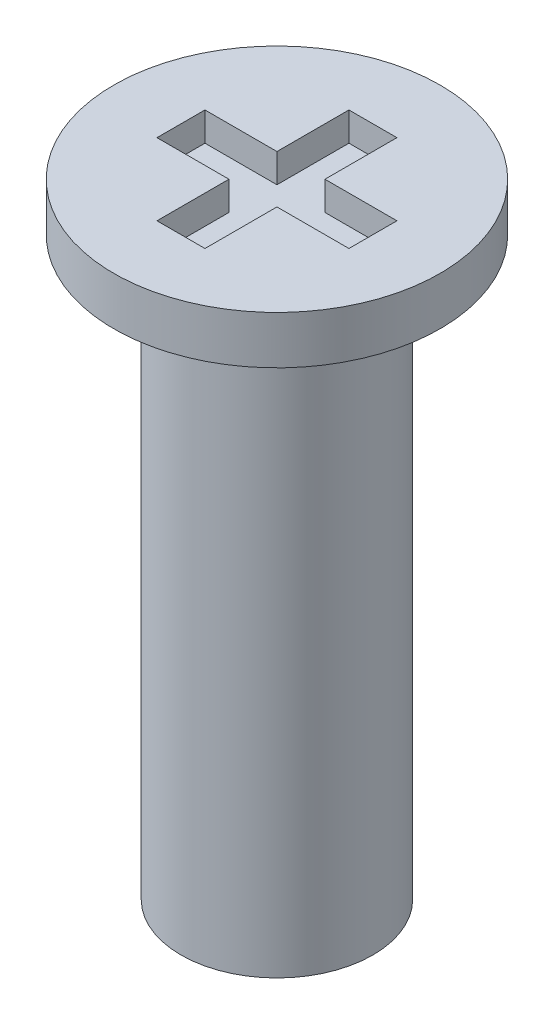
ISO-10303-21;
HEADER;
FILE_DESCRIPTION(('STEP AP214'),'2;1');
FILE_NAME('part.step','',(''),(''),'','','');
FILE_SCHEMA(('AUTOMOTIVE_DESIGN { 1 0 10303 214 1 1 1 1 }'));
ENDSEC;
DATA;
#1=APPLICATION_CONTEXT('core data for automotive mechanical design processes');
#2=APPLICATION_PROTOCOL_DEFINITION('international standard','automotive_design',2000,#1);
#3=PRODUCT_CONTEXT('',#1,'mechanical');
#4=PRODUCT('Part','Part','',(#3));
#5=PRODUCT_RELATED_PRODUCT_CATEGORY('part','',(#4));
#6=PRODUCT_DEFINITION_FORMATION('','',#4);
#7=PRODUCT_DEFINITION_CONTEXT('part definition',#1,'design');
#8=PRODUCT_DEFINITION('design','',#6,#7);
#9=PRODUCT_DEFINITION_SHAPE('','',#8);
#10=(LENGTH_UNIT() NAMED_UNIT(*) SI_UNIT(.MILLI.,.METRE.));
#11=(NAMED_UNIT(*) PLANE_ANGLE_UNIT() SI_UNIT($,.RADIAN.));
#12=(NAMED_UNIT(*) SI_UNIT($,.STERADIAN.) SOLID_ANGLE_UNIT());
#13=UNCERTAINTY_MEASURE_WITH_UNIT(LENGTH_MEASURE(1.E-05),#10,'distance_accuracy_value','');
#14=(GEOMETRIC_REPRESENTATION_CONTEXT(3) GLOBAL_UNCERTAINTY_ASSIGNED_CONTEXT((#13)) GLOBAL_UNIT_ASSIGNED_CONTEXT((#10,
#11,#12)) REPRESENTATION_CONTEXT('',''));
#15=CARTESIAN_POINT('',(0.,0.,0.));
#16=DIRECTION('',(0.,0.,1.));
#17=DIRECTION('',(1.,0.,0.));
#18=AXIS2_PLACEMENT_3D('',#15,#16,#17);
#19=CARTESIAN_POINT('',(0.,0.,0.));
#20=DIRECTION('',(0.,1.,0.));
#21=DIRECTION('',(0.,0.,1.));
#22=AXIS2_PLACEMENT_3D('',#19,#20,#21);
#23=PLANE('',#22);
#24=DIRECTION('',(-1.,0.,0.));
#25=VECTOR('',#24,1.);
#26=CARTESIAN_POINT('',(0.,0.,-0.25));
#27=LINE('',#26,#25);
#28=CARTESIAN_POINT('',(1.,0.,-0.249999999999997));
#29=VERTEX_POINT('',#28);
#30=CARTESIAN_POINT('',(0.25,0.,-0.249999999999999));
#31=VERTEX_POINT('',#30);
#32=EDGE_CURVE('E194',#29,#31,#27,.T.);
#33=ORIENTED_EDGE('',*,*,#32,.F.);
#34=DIRECTION('',(0.,0.,-1.));
#35=VECTOR('',#34,1.);
#36=CARTESIAN_POINT('',(1.,0.,-0.249999999999997));
#37=LINE('',#36,#35);
#38=CARTESIAN_POINT('',(0.999999999999999,0.,0.250000000000003));
#39=VERTEX_POINT('',#38);
#40=EDGE_CURVE('E140',#39,#29,#37,.T.);
#41=ORIENTED_EDGE('',*,*,#40,.F.);
#42=DIRECTION('',(1.,0.,0.));
#43=VECTOR('',#42,1.);
#44=CARTESIAN_POINT('',(0.,0.,0.25));
#45=LINE('',#44,#43);
#46=CARTESIAN_POINT('',(0.25,0.,0.250000000000003));
#47=VERTEX_POINT('',#46);
#48=EDGE_CURVE('E196',#47,#39,#45,.T.);
#49=ORIENTED_EDGE('',*,*,#48,.F.);
#50=DIRECTION('',(0.,0.,-1.));
#51=VECTOR('',#50,1.);
#52=CARTESIAN_POINT('',(0.25,0.,0.));
#53=LINE('',#52,#51);
#54=CARTESIAN_POINT('',(0.25,0.,1.));
#55=VERTEX_POINT('',#54);
#56=EDGE_CURVE('E166',#55,#47,#53,.T.);
#57=ORIENTED_EDGE('',*,*,#56,.F.);
#58=DIRECTION('',(1.,0.,0.));
#59=VECTOR('',#58,1.);
#60=CARTESIAN_POINT('',(0.25,0.,1.));
#61=LINE('',#60,#59);
#62=CARTESIAN_POINT('',(-0.25,0.,1.));
#63=VERTEX_POINT('',#62);
#64=EDGE_CURVE('E170',#63,#55,#61,.T.);
#65=ORIENTED_EDGE('',*,*,#64,.F.);
#66=DIRECTION('',(0.,0.,1.));
#67=VECTOR('',#66,1.);
#68=CARTESIAN_POINT('',(-0.25,0.,0.));
#69=LINE('',#68,#67);
#70=CARTESIAN_POINT('',(-0.25,0.,0.249999999999998));
#71=VERTEX_POINT('',#70);
#72=EDGE_CURVE('E178',#71,#63,#69,.T.);
#73=ORIENTED_EDGE('',*,*,#72,.F.);
#74=DIRECTION('',(1.,0.,0.));
#75=VECTOR('',#74,1.);
#76=CARTESIAN_POINT('',(0.,0.,0.25));
#77=LINE('',#76,#75);
#78=CARTESIAN_POINT('',(-1.,0.,0.24999999999999));
#79=VERTEX_POINT('',#78);
#80=EDGE_CURVE('E159',#79,#71,#77,.T.);
#81=ORIENTED_EDGE('',*,*,#80,.F.);
#82=DIRECTION('',(0.,0.,1.));
#83=VECTOR('',#82,1.);
#84=CARTESIAN_POINT('',(-1.,0.,0.24999999999999));
#85=LINE('',#84,#83);
#86=CARTESIAN_POINT('',(-0.999999999999997,0.,-0.25000000000001));
#87=VERTEX_POINT('',#86);
#88=EDGE_CURVE('E156',#87,#79,#85,.T.);
#89=ORIENTED_EDGE('',*,*,#88,.F.);
#90=CARTESIAN_POINT('',(-0.25,0.,-0.250000000000001));
#91=VERTEX_POINT('',#90);
#92=EDGE_CURVE('E146',#91,#87,#27,.T.);
#93=ORIENTED_EDGE('',*,*,#92,.F.);
#94=DIRECTION('',(0.,0.,1.));
#95=VECTOR('',#94,1.);
#96=CARTESIAN_POINT('',(-0.25,0.,0.));
#97=LINE('',#96,#95);
#98=CARTESIAN_POINT('',(-0.25,0.,-1.));
#99=VERTEX_POINT('',#98);
#100=EDGE_CURVE('E208',#99,#91,#97,.T.);
#101=ORIENTED_EDGE('',*,*,#100,.F.);
#102=DIRECTION('',(-1.,0.,0.));
#103=VECTOR('',#102,1.);
#104=CARTESIAN_POINT('',(-0.25,0.,-1.));
#105=LINE('',#104,#103);
#106=CARTESIAN_POINT('',(0.25,0.,-1.));
#107=VERTEX_POINT('',#106);
#108=EDGE_CURVE('E211',#107,#99,#105,.T.);
#109=ORIENTED_EDGE('',*,*,#108,.F.);
#110=DIRECTION('',(0.,0.,-1.));
#111=VECTOR('',#110,1.);
#112=CARTESIAN_POINT('',(0.25,0.,0.));
#113=LINE('',#112,#111);
#114=EDGE_CURVE('E66',#31,#107,#113,.T.);
#115=ORIENTED_EDGE('',*,*,#114,.F.);
#116=EDGE_LOOP('',(#33,#41,#49,#57,#65,#73,#81,#89,#93,#101,#109,#115));
#117=FACE_BOUND('',#116,.T.);
#118=CARTESIAN_POINT('',(0.,0.,0.));
#119=DIRECTION('',(0.,-1.,0.));
#120=DIRECTION('',(0.,0.,-1.));
#121=AXIS2_PLACEMENT_3D('',#118,#119,#120);
#122=CIRCLE('',#121,1.7);
#123=CARTESIAN_POINT('',(0.,0.,-1.7));
#124=VERTEX_POINT('',#123);
#125=EDGE_CURVE('E11',#124,#124,#122,.T.);
#126=ORIENTED_EDGE('',*,*,#125,.F.);
#127=EDGE_LOOP('',(#126));
#128=FACE_BOUND('',#127,.T.);
#129=ADVANCED_FACE('F38',(#117,#128),#23,.T.);
#130=CARTESIAN_POINT('',(0.,-6.5,0.));
#131=DIRECTION('',(0.,-1.,0.));
#132=DIRECTION('',(0.,0.,-1.));
#133=AXIS2_PLACEMENT_3D('',#130,#131,#132);
#134=CYLINDRICAL_SURFACE('',#133,1.7);
#135=ORIENTED_EDGE('',*,*,#125,.T.);
#136=EDGE_LOOP('',(#135));
#137=FACE_BOUND('',#136,.T.);
#138=CARTESIAN_POINT('',(0.,-0.5,0.));
#139=DIRECTION('',(0.,-1.,0.));
#140=DIRECTION('',(0.,0.,-1.));
#141=AXIS2_PLACEMENT_3D('',#138,#139,#140);
#142=CIRCLE('',#141,1.7);
#143=CARTESIAN_POINT('',(0.,-0.5,-1.7));
#144=VERTEX_POINT('',#143);
#145=EDGE_CURVE('E46',#144,#144,#142,.T.);
#146=ORIENTED_EDGE('',*,*,#145,.F.);
#147=EDGE_LOOP('',(#146));
#148=FACE_BOUND('',#147,.T.);
#149=ADVANCED_FACE('F233',(#137,#148),#134,.T.);
#150=CARTESIAN_POINT('',(1.7,-0.5,0.));
#151=DIRECTION('',(0.,-1.,0.));
#152=DIRECTION('',(0.,0.,-1.));
#153=AXIS2_PLACEMENT_3D('',#150,#151,#152);
#154=PLANE('',#153);
#155=ORIENTED_EDGE('',*,*,#145,.T.);
#156=EDGE_LOOP('',(#155));
#157=FACE_BOUND('',#156,.T.);
#158=CARTESIAN_POINT('',(0.,-0.5,0.));
#159=DIRECTION('',(0.,-1.,0.));
#160=DIRECTION('',(0.,0.,-1.));
#161=AXIS2_PLACEMENT_3D('',#158,#159,#160);
#162=CIRCLE('',#161,1.);
#163=CARTESIAN_POINT('',(0.,-0.5,-1.));
#164=VERTEX_POINT('',#163);
#165=EDGE_CURVE('E225',#164,#164,#162,.T.);
#166=ORIENTED_EDGE('',*,*,#165,.F.);
#167=EDGE_LOOP('',(#166));
#168=FACE_BOUND('',#167,.T.);
#169=ADVANCED_FACE('F230',(#157,#168),#154,.T.);
#170=CARTESIAN_POINT('',(0.,-6.5,0.));
#171=DIRECTION('',(0.,-1.,0.));
#172=DIRECTION('',(0.,0.,-1.));
#173=AXIS2_PLACEMENT_3D('',#170,#171,#172);
#174=CYLINDRICAL_SURFACE('',#173,1.);
#175=ORIENTED_EDGE('',*,*,#165,.T.);
#176=EDGE_LOOP('',(#175));
#177=FACE_BOUND('',#176,.T.);
#178=CARTESIAN_POINT('',(0.,-6.5,0.));
#179=DIRECTION('',(0.,-1.,0.));
#180=DIRECTION('',(0.,0.,-1.));
#181=AXIS2_PLACEMENT_3D('',#178,#179,#180);
#182=CIRCLE('',#181,1.);
#183=CARTESIAN_POINT('',(0.,-6.5,-1.));
#184=VERTEX_POINT('',#183);
#185=EDGE_CURVE('E221',#184,#184,#182,.T.);
#186=ORIENTED_EDGE('',*,*,#185,.F.);
#187=EDGE_LOOP('',(#186));
#188=FACE_BOUND('',#187,.T.);
#189=ADVANCED_FACE('F240',(#177,#188),#174,.T.);
#190=CARTESIAN_POINT('',(1.,-6.5,0.));
#191=DIRECTION('',(0.,-1.,0.));
#192=DIRECTION('',(0.,0.,-1.));
#193=AXIS2_PLACEMENT_3D('',#190,#191,#192);
#194=PLANE('',#193);
#195=ORIENTED_EDGE('',*,*,#185,.T.);
#196=EDGE_LOOP('',(#195));
#197=FACE_BOUND('',#196,.T.);
#198=ADVANCED_FACE('F246',(#197),#194,.T.);
#199=CARTESIAN_POINT('',(-0.25,-0.3,0.));
#200=DIRECTION('',(-1.,0.,0.));
#201=DIRECTION('',(0.,-1.,0.));
#202=AXIS2_PLACEMENT_3D('',#199,#200,#201);
#203=PLANE('',#202);
#204=ORIENTED_EDGE('',*,*,#100,.T.);
#205=DIRECTION('',(0.,-1.,0.));
#206=VECTOR('',#205,1.);
#207=CARTESIAN_POINT('',(-0.25,-0.3,-0.250000000000001));
#208=LINE('',#207,#206);
#209=CARTESIAN_POINT('',(-0.25,-0.3,-0.250000000000001));
#210=VERTEX_POINT('',#209);
#211=EDGE_CURVE('E206',#91,#210,#208,.T.);
#212=ORIENTED_EDGE('',*,*,#211,.T.);
#213=DIRECTION('',(0.,0.,1.));
#214=VECTOR('',#213,1.);
#215=CARTESIAN_POINT('',(-0.25,-0.3,0.));
#216=LINE('',#215,#214);
#217=CARTESIAN_POINT('',(-0.25,-0.3,-1.));
#218=VERTEX_POINT('',#217);
#219=EDGE_CURVE('E138',#218,#210,#216,.T.);
#220=ORIENTED_EDGE('',*,*,#219,.F.);
#221=DIRECTION('',(0.,1.,0.));
#222=VECTOR('',#221,1.);
#223=CARTESIAN_POINT('',(-0.25,-0.3,-1.));
#224=LINE('',#223,#222);
#225=EDGE_CURVE('E54',#218,#99,#224,.T.);
#226=ORIENTED_EDGE('',*,*,#225,.T.);
#227=EDGE_LOOP('',(#204,#212,#220,#226));
#228=FACE_BOUND('',#227,.T.);
#229=ADVANCED_FACE('F250',(#228),#203,.F.);
#230=CARTESIAN_POINT('',(-0.25,-0.3,-1.));
#231=DIRECTION('',(0.,0.,-1.));
#232=DIRECTION('',(-1.,0.,0.));
#233=AXIS2_PLACEMENT_3D('',#230,#231,#232);
#234=PLANE('',#233);
#235=ORIENTED_EDGE('',*,*,#108,.T.);
#236=ORIENTED_EDGE('',*,*,#225,.F.);
#237=DIRECTION('',(-1.,0.,0.));
#238=VECTOR('',#237,1.);
#239=CARTESIAN_POINT('',(-0.25,-0.3,-1.));
#240=LINE('',#239,#238);
#241=CARTESIAN_POINT('',(0.25,-0.3,-1.));
#242=VERTEX_POINT('',#241);
#243=EDGE_CURVE('E213',#242,#218,#240,.T.);
#244=ORIENTED_EDGE('',*,*,#243,.F.);
#245=DIRECTION('',(0.,1.,0.));
#246=VECTOR('',#245,1.);
#247=CARTESIAN_POINT('',(0.25,-0.3,-1.));
#248=LINE('',#247,#246);
#249=EDGE_CURVE('E215',#242,#107,#248,.T.);
#250=ORIENTED_EDGE('',*,*,#249,.T.);
#251=EDGE_LOOP('',(#235,#236,#244,#250));
#252=FACE_BOUND('',#251,.T.);
#253=ADVANCED_FACE('F254',(#252),#234,.F.);
#254=CARTESIAN_POINT('',(0.25,-0.3,0.));
#255=DIRECTION('',(1.,0.,0.));
#256=DIRECTION('',(0.,1.,0.));
#257=AXIS2_PLACEMENT_3D('',#254,#255,#256);
#258=PLANE('',#257);
#259=DIRECTION('',(0.,0.,-1.));
#260=VECTOR('',#259,1.);
#261=CARTESIAN_POINT('',(0.25,-0.3,0.));
#262=LINE('',#261,#260);
#263=CARTESIAN_POINT('',(0.25,-0.3,-0.249999999999999));
#264=VERTEX_POINT('',#263);
#265=EDGE_CURVE('E210',#264,#242,#262,.T.);
#266=ORIENTED_EDGE('',*,*,#265,.F.);
#267=DIRECTION('',(0.,1.,0.));
#268=VECTOR('',#267,1.);
#269=CARTESIAN_POINT('',(0.25,-0.3,-0.249999999999999));
#270=LINE('',#269,#268);
#271=EDGE_CURVE('E202',#264,#31,#270,.T.);
#272=ORIENTED_EDGE('',*,*,#271,.T.);
#273=ORIENTED_EDGE('',*,*,#114,.T.);
#274=ORIENTED_EDGE('',*,*,#249,.F.);
#275=EDGE_LOOP('',(#266,#272,#273,#274));
#276=FACE_BOUND('',#275,.T.);
#277=ADVANCED_FACE('F256',(#276),#258,.F.);
#278=CARTESIAN_POINT('',(0.,-0.3,0.));
#279=DIRECTION('',(0.,-1.,0.));
#280=DIRECTION('',(1.,0.,0.));
#281=AXIS2_PLACEMENT_3D('',#278,#279,#280);
#282=PLANE('',#281);
#283=DIRECTION('',(-1.,0.,0.));
#284=VECTOR('',#283,1.);
#285=CARTESIAN_POINT('',(0.,-0.3,-0.25));
#286=LINE('',#285,#284);
#287=CARTESIAN_POINT('',(1.,-0.3,-0.249999999999997));
#288=VERTEX_POINT('',#287);
#289=EDGE_CURVE('E139',#288,#264,#286,.T.);
#290=ORIENTED_EDGE('',*,*,#289,.T.);
#291=ORIENTED_EDGE('',*,*,#265,.T.);
#292=ORIENTED_EDGE('',*,*,#243,.T.);
#293=ORIENTED_EDGE('',*,*,#219,.T.);
#294=CARTESIAN_POINT('',(-0.999999999999997,-0.3,-0.25000000000001));
#295=VERTEX_POINT('',#294);
#296=EDGE_CURVE('E74',#210,#295,#286,.T.);
#297=ORIENTED_EDGE('',*,*,#296,.T.);
#298=DIRECTION('',(0.,0.,1.));
#299=VECTOR('',#298,1.);
#300=CARTESIAN_POINT('',(-1.,-0.3,0.24999999999999));
#301=LINE('',#300,#299);
#302=CARTESIAN_POINT('',(-1.,-0.3,0.24999999999999));
#303=VERTEX_POINT('',#302);
#304=EDGE_CURVE('E136',#295,#303,#301,.T.);
#305=ORIENTED_EDGE('',*,*,#304,.T.);
#306=DIRECTION('',(1.,0.,0.));
#307=VECTOR('',#306,1.);
#308=CARTESIAN_POINT('',(0.,-0.3,0.25));
#309=LINE('',#308,#307);
#310=CARTESIAN_POINT('',(-0.25,-0.3,0.249999999999998));
#311=VERTEX_POINT('',#310);
#312=EDGE_CURVE('E154',#303,#311,#309,.T.);
#313=ORIENTED_EDGE('',*,*,#312,.T.);
#314=DIRECTION('',(0.,0.,1.));
#315=VECTOR('',#314,1.);
#316=CARTESIAN_POINT('',(-0.25,-0.3,0.));
#317=LINE('',#316,#315);
#318=CARTESIAN_POINT('',(-0.25,-0.3,1.));
#319=VERTEX_POINT('',#318);
#320=EDGE_CURVE('E169',#311,#319,#317,.T.);
#321=ORIENTED_EDGE('',*,*,#320,.T.);
#322=DIRECTION('',(1.,0.,0.));
#323=VECTOR('',#322,1.);
#324=CARTESIAN_POINT('',(0.25,-0.3,1.));
#325=LINE('',#324,#323);
#326=CARTESIAN_POINT('',(0.25,-0.3,1.));
#327=VERTEX_POINT('',#326);
#328=EDGE_CURVE('E172',#319,#327,#325,.T.);
#329=ORIENTED_EDGE('',*,*,#328,.T.);
#330=DIRECTION('',(0.,0.,-1.));
#331=VECTOR('',#330,1.);
#332=CARTESIAN_POINT('',(0.25,-0.3,0.));
#333=LINE('',#332,#331);
#334=CARTESIAN_POINT('',(0.25,-0.3,0.250000000000003));
#335=VERTEX_POINT('',#334);
#336=EDGE_CURVE('E167',#327,#335,#333,.T.);
#337=ORIENTED_EDGE('',*,*,#336,.T.);
#338=DIRECTION('',(1.,0.,0.));
#339=VECTOR('',#338,1.);
#340=CARTESIAN_POINT('',(0.,-0.3,0.25));
#341=LINE('',#340,#339);
#342=CARTESIAN_POINT('',(0.999999999999999,-0.3,0.250000000000003));
#343=VERTEX_POINT('',#342);
#344=EDGE_CURVE('E188',#335,#343,#341,.T.);
#345=ORIENTED_EDGE('',*,*,#344,.T.);
#346=DIRECTION('',(0.,0.,-1.));
#347=VECTOR('',#346,1.);
#348=CARTESIAN_POINT('',(1.,-0.3,-0.249999999999997));
#349=LINE('',#348,#347);
#350=EDGE_CURVE('E190',#343,#288,#349,.T.);
#351=ORIENTED_EDGE('',*,*,#350,.T.);
#352=EDGE_LOOP('',(#290,#291,#292,#293,#297,#305,#313,#321,#329,#337,#345,#351));
#353=FACE_BOUND('',#352,.T.);
#354=ADVANCED_FACE('F134',(#353),#282,.F.);
#355=CARTESIAN_POINT('',(0.,-0.3,-0.25));
#356=DIRECTION('',(0.,0.,-1.));
#357=DIRECTION('',(-1.,0.,0.));
#358=AXIS2_PLACEMENT_3D('',#355,#356,#357);
#359=PLANE('',#358);
#360=ORIENTED_EDGE('',*,*,#92,.T.);
#361=DIRECTION('',(0.,1.,0.));
#362=VECTOR('',#361,1.);
#363=CARTESIAN_POINT('',(-0.999999999999997,-0.3,-0.25000000000001));
#364=LINE('',#363,#362);
#365=EDGE_CURVE('E143',#295,#87,#364,.T.);
#366=ORIENTED_EDGE('',*,*,#365,.F.);
#367=ORIENTED_EDGE('',*,*,#296,.F.);
#368=ORIENTED_EDGE('',*,*,#211,.F.);
#369=EDGE_LOOP('',(#360,#366,#367,#368));
#370=FACE_BOUND('',#369,.T.);
#371=ADVANCED_FACE('F144',(#370),#359,.F.);
#372=ORIENTED_EDGE('',*,*,#289,.F.);
#373=DIRECTION('',(0.,1.,0.));
#374=VECTOR('',#373,1.);
#375=CARTESIAN_POINT('',(1.,-0.3,-0.249999999999997));
#376=LINE('',#375,#374);
#377=EDGE_CURVE('E200',#288,#29,#376,.T.);
#378=ORIENTED_EDGE('',*,*,#377,.T.);
#379=ORIENTED_EDGE('',*,*,#32,.T.);
#380=ORIENTED_EDGE('',*,*,#271,.F.);
#381=EDGE_LOOP('',(#372,#378,#379,#380));
#382=FACE_BOUND('',#381,.T.);
#383=ADVANCED_FACE('F265',(#382),#359,.F.);
#384=CARTESIAN_POINT('',(1.,-0.3,-0.249999999999997));
#385=DIRECTION('',(1.,0.,0.));
#386=DIRECTION('',(0.,0.,-1.));
#387=AXIS2_PLACEMENT_3D('',#384,#385,#386);
#388=PLANE('',#387);
#389=ORIENTED_EDGE('',*,*,#40,.T.);
#390=ORIENTED_EDGE('',*,*,#377,.F.);
#391=ORIENTED_EDGE('',*,*,#350,.F.);
#392=DIRECTION('',(0.,1.,0.));
#393=VECTOR('',#392,1.);
#394=CARTESIAN_POINT('',(0.999999999999999,-0.3,0.250000000000003));
#395=LINE('',#394,#393);
#396=EDGE_CURVE('E193',#343,#39,#395,.T.);
#397=ORIENTED_EDGE('',*,*,#396,.T.);
#398=EDGE_LOOP('',(#389,#390,#391,#397));
#399=FACE_BOUND('',#398,.T.);
#400=ADVANCED_FACE('F270',(#399),#388,.F.);
#401=CARTESIAN_POINT('',(0.,-0.3,0.25));
#402=DIRECTION('',(0.,0.,1.));
#403=DIRECTION('',(1.,0.,0.));
#404=AXIS2_PLACEMENT_3D('',#401,#402,#403);
#405=PLANE('',#404);
#406=DIRECTION('',(0.,1.,0.));
#407=VECTOR('',#406,1.);
#408=CARTESIAN_POINT('',(0.25,-0.3,0.250000000000001));
#409=LINE('',#408,#407);
#410=EDGE_CURVE('E184',#335,#47,#409,.T.);
#411=ORIENTED_EDGE('',*,*,#410,.T.);
#412=ORIENTED_EDGE('',*,*,#48,.T.);
#413=ORIENTED_EDGE('',*,*,#396,.F.);
#414=ORIENTED_EDGE('',*,*,#344,.F.);
#415=EDGE_LOOP('',(#411,#412,#413,#414));
#416=FACE_BOUND('',#415,.T.);
#417=ADVANCED_FACE('F266',(#416),#405,.F.);
#418=CARTESIAN_POINT('',(0.25,-0.3,0.));
#419=DIRECTION('',(1.,0.,0.));
#420=DIRECTION('',(0.,1.,0.));
#421=AXIS2_PLACEMENT_3D('',#418,#419,#420);
#422=PLANE('',#421);
#423=ORIENTED_EDGE('',*,*,#336,.F.);
#424=DIRECTION('',(0.,1.,0.));
#425=VECTOR('',#424,1.);
#426=CARTESIAN_POINT('',(0.25,-0.3,1.));
#427=LINE('',#426,#425);
#428=EDGE_CURVE('E182',#327,#55,#427,.T.);
#429=ORIENTED_EDGE('',*,*,#428,.T.);
#430=ORIENTED_EDGE('',*,*,#56,.T.);
#431=ORIENTED_EDGE('',*,*,#410,.F.);
#432=EDGE_LOOP('',(#423,#429,#430,#431));
#433=FACE_BOUND('',#432,.T.);
#434=ADVANCED_FACE('F269',(#433),#422,.F.);
#435=CARTESIAN_POINT('',(0.25,-0.3,1.));
#436=DIRECTION('',(0.,0.,1.));
#437=DIRECTION('',(1.,0.,0.));
#438=AXIS2_PLACEMENT_3D('',#435,#436,#437);
#439=PLANE('',#438);
#440=ORIENTED_EDGE('',*,*,#64,.T.);
#441=ORIENTED_EDGE('',*,*,#428,.F.);
#442=ORIENTED_EDGE('',*,*,#328,.F.);
#443=DIRECTION('',(0.,1.,0.));
#444=VECTOR('',#443,1.);
#445=CARTESIAN_POINT('',(-0.25,-0.3,1.));
#446=LINE('',#445,#444);
#447=EDGE_CURVE('E175',#319,#63,#446,.T.);
#448=ORIENTED_EDGE('',*,*,#447,.T.);
#449=EDGE_LOOP('',(#440,#441,#442,#448));
#450=FACE_BOUND('',#449,.T.);
#451=ADVANCED_FACE('F277',(#450),#439,.F.);
#452=CARTESIAN_POINT('',(-0.25,-0.3,0.));
#453=DIRECTION('',(-1.,0.,0.));
#454=DIRECTION('',(0.,-1.,0.));
#455=AXIS2_PLACEMENT_3D('',#452,#453,#454);
#456=PLANE('',#455);
#457=DIRECTION('',(0.,1.,0.));
#458=VECTOR('',#457,1.);
#459=CARTESIAN_POINT('',(-0.25,-0.3,0.249999999999998));
#460=LINE('',#459,#458);
#461=EDGE_CURVE('E163',#311,#71,#460,.T.);
#462=ORIENTED_EDGE('',*,*,#461,.T.);
#463=ORIENTED_EDGE('',*,*,#72,.T.);
#464=ORIENTED_EDGE('',*,*,#447,.F.);
#465=ORIENTED_EDGE('',*,*,#320,.F.);
#466=EDGE_LOOP('',(#462,#463,#464,#465));
#467=FACE_BOUND('',#466,.T.);
#468=ADVANCED_FACE('F279',(#467),#456,.F.);
#469=CARTESIAN_POINT('',(0.,-0.3,0.25));
#470=DIRECTION('',(0.,0.,1.));
#471=DIRECTION('',(1.,0.,0.));
#472=AXIS2_PLACEMENT_3D('',#469,#470,#471);
#473=PLANE('',#472);
#474=ORIENTED_EDGE('',*,*,#312,.F.);
#475=DIRECTION('',(0.,1.,0.));
#476=VECTOR('',#475,1.);
#477=CARTESIAN_POINT('',(-1.,-0.3,0.24999999999999));
#478=LINE('',#477,#476);
#479=EDGE_CURVE('E150',#303,#79,#478,.T.);
#480=ORIENTED_EDGE('',*,*,#479,.T.);
#481=ORIENTED_EDGE('',*,*,#80,.T.);
#482=ORIENTED_EDGE('',*,*,#461,.F.);
#483=EDGE_LOOP('',(#474,#480,#481,#482));
#484=FACE_BOUND('',#483,.T.);
#485=ADVANCED_FACE('F282',(#484),#473,.F.);
#486=CARTESIAN_POINT('',(-1.,-0.3,0.24999999999999));
#487=DIRECTION('',(-1.,0.,0.));
#488=DIRECTION('',(0.,0.,1.));
#489=AXIS2_PLACEMENT_3D('',#486,#487,#488);
#490=PLANE('',#489);
#491=ORIENTED_EDGE('',*,*,#88,.T.);
#492=ORIENTED_EDGE('',*,*,#479,.F.);
#493=ORIENTED_EDGE('',*,*,#304,.F.);
#494=ORIENTED_EDGE('',*,*,#365,.T.);
#495=EDGE_LOOP('',(#491,#492,#493,#494));
#496=FACE_BOUND('',#495,.T.);
#497=ADVANCED_FACE('F152',(#496),#490,.F.);
#498=CLOSED_SHELL('',(#129,#149,#169,#189,#198,#229,#253,#277,#354,#371,#383,#400,#417,#434,
#451,#468,#485,#497));
#499=MANIFOLD_SOLID_BREP('B2',#498);
#500=ADVANCED_BREP_SHAPE_REPRESENTATION('',(#18,#499),#14);
#501=SHAPE_DEFINITION_REPRESENTATION(#9,#500);
ENDSEC;
END-ISO-10303-21;
